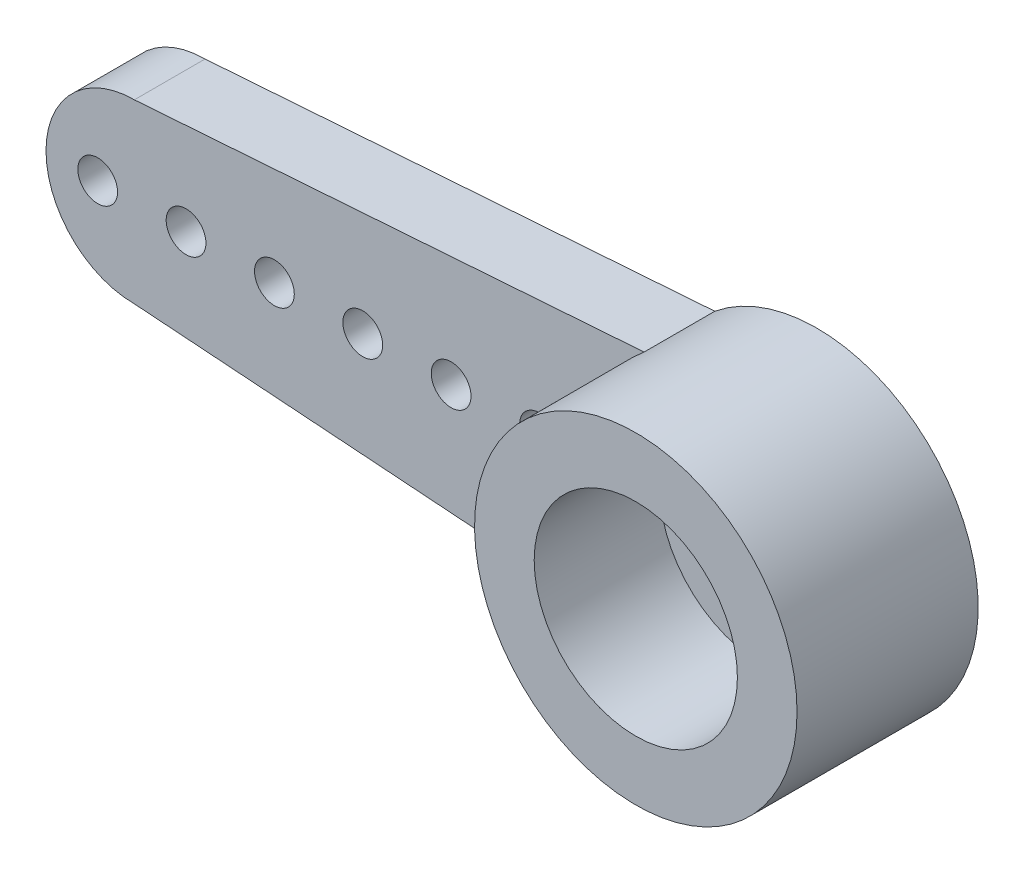
ISO-10303-21;
HEADER;
FILE_DESCRIPTION(('STEP AP214'),'2;1');
FILE_NAME('part.step','',(''),(''),'','','');
FILE_SCHEMA(('AUTOMOTIVE_DESIGN { 1 0 10303 214 1 1 1 1 }'));
ENDSEC;
DATA;
#1=APPLICATION_CONTEXT('core data for automotive mechanical design processes');
#2=APPLICATION_PROTOCOL_DEFINITION('international standard','automotive_design',2000,#1);
#3=PRODUCT_CONTEXT('',#1,'mechanical');
#4=PRODUCT('Part','Part','',(#3));
#5=PRODUCT_RELATED_PRODUCT_CATEGORY('part','',(#4));
#6=PRODUCT_DEFINITION_FORMATION('','',#4);
#7=PRODUCT_DEFINITION_CONTEXT('part definition',#1,'design');
#8=PRODUCT_DEFINITION('design','',#6,#7);
#9=PRODUCT_DEFINITION_SHAPE('','',#8);
#10=(LENGTH_UNIT() NAMED_UNIT(*) SI_UNIT(.MILLI.,.METRE.));
#11=(NAMED_UNIT(*) PLANE_ANGLE_UNIT() SI_UNIT($,.RADIAN.));
#12=(NAMED_UNIT(*) SI_UNIT($,.STERADIAN.) SOLID_ANGLE_UNIT());
#13=UNCERTAINTY_MEASURE_WITH_UNIT(LENGTH_MEASURE(1.E-05),#10,'distance_accuracy_value','');
#14=(GEOMETRIC_REPRESENTATION_CONTEXT(3) GLOBAL_UNCERTAINTY_ASSIGNED_CONTEXT((#13)) GLOBAL_UNIT_ASSIGNED_CONTEXT((#10,
#11,#12)) REPRESENTATION_CONTEXT('',''));
#15=CARTESIAN_POINT('',(0.,0.,0.));
#16=DIRECTION('',(0.,0.,1.));
#17=DIRECTION('',(1.,0.,0.));
#18=AXIS2_PLACEMENT_3D('',#15,#16,#17);
#19=CARTESIAN_POINT('',(0.,0.,2.84));
#20=DIRECTION('',(0.,0.,-1.));
#21=DIRECTION('',(-1.,0.,0.));
#22=AXIS2_PLACEMENT_3D('',#19,#20,#21);
#23=CYLINDRICAL_SURFACE('',#22,1.3);
#24=CARTESIAN_POINT('',(0.,0.,1.26));
#25=DIRECTION('',(0.,0.,1.));
#26=DIRECTION('',(1.,0.,0.));
#27=AXIS2_PLACEMENT_3D('',#24,#25,#26);
#28=CIRCLE('',#27,1.3);
#29=CARTESIAN_POINT('',(-1.3,0.,1.26));
#30=VERTEX_POINT('',#29);
#31=EDGE_CURVE('E117',#30,#30,#28,.T.);
#32=CARTESIAN_POINT('',(0.,0.,0.78));
#33=DIRECTION('',(0.,0.,-1.));
#34=DIRECTION('',(-1.,0.,0.));
#35=AXIS2_PLACEMENT_3D('',#32,#33,#34);
#36=CIRCLE('',#35,1.3);
#37=CARTESIAN_POINT('',(-1.3,0.,0.78));
#38=VERTEX_POINT('',#37);
#39=EDGE_CURVE('E34',#38,#38,#36,.F.);
#40=CARTESIAN_POINT('',(-1.3,0.,1.26));
#41=CARTESIAN_POINT('',(-1.3,0.,1.255));
#42=CARTESIAN_POINT('',(-1.3,0.,1.25));
#43=CARTESIAN_POINT('',(-1.3,0.,1.24));
#44=CARTESIAN_POINT('',(-1.3,0.,1.235));
#45=CARTESIAN_POINT('',(-1.3,0.,1.225));
#46=CARTESIAN_POINT('',(-1.3,0.,1.22));
#47=CARTESIAN_POINT('',(-1.3,0.,1.21));
#48=CARTESIAN_POINT('',(-1.3,0.,1.205));
#49=CARTESIAN_POINT('',(-1.3,0.,1.195));
#50=CARTESIAN_POINT('',(-1.3,0.,1.19));
#51=CARTESIAN_POINT('',(-1.3,0.,1.18));
#52=CARTESIAN_POINT('',(-1.3,0.,1.175));
#53=CARTESIAN_POINT('',(-1.3,0.,1.165));
#54=CARTESIAN_POINT('',(-1.3,0.,1.16));
#55=CARTESIAN_POINT('',(-1.3,0.,1.15));
#56=CARTESIAN_POINT('',(-1.3,0.,1.145));
#57=CARTESIAN_POINT('',(-1.3,0.,1.135));
#58=CARTESIAN_POINT('',(-1.3,0.,1.13));
#59=CARTESIAN_POINT('',(-1.3,0.,1.12));
#60=CARTESIAN_POINT('',(-1.3,0.,1.115));
#61=CARTESIAN_POINT('',(-1.3,0.,1.105));
#62=CARTESIAN_POINT('',(-1.3,0.,1.1));
#63=CARTESIAN_POINT('',(-1.3,0.,1.09));
#64=CARTESIAN_POINT('',(-1.3,0.,1.085));
#65=CARTESIAN_POINT('',(-1.3,0.,1.075));
#66=CARTESIAN_POINT('',(-1.3,0.,1.07));
#67=CARTESIAN_POINT('',(-1.3,0.,1.06));
#68=CARTESIAN_POINT('',(-1.3,0.,1.055));
#69=CARTESIAN_POINT('',(-1.3,0.,1.045));
#70=CARTESIAN_POINT('',(-1.3,0.,1.04));
#71=CARTESIAN_POINT('',(-1.3,0.,1.03));
#72=CARTESIAN_POINT('',(-1.3,0.,1.025));
#73=CARTESIAN_POINT('',(-1.3,0.,1.015));
#74=CARTESIAN_POINT('',(-1.3,0.,1.01));
#75=CARTESIAN_POINT('',(-1.3,0.,1.));
#76=CARTESIAN_POINT('',(-1.3,0.,0.995));
#77=CARTESIAN_POINT('',(-1.3,0.,0.985));
#78=CARTESIAN_POINT('',(-1.3,0.,0.98));
#79=CARTESIAN_POINT('',(-1.3,0.,0.97));
#80=CARTESIAN_POINT('',(-1.3,0.,0.965));
#81=CARTESIAN_POINT('',(-1.3,0.,0.955));
#82=CARTESIAN_POINT('',(-1.3,0.,0.95));
#83=CARTESIAN_POINT('',(-1.3,0.,0.94));
#84=CARTESIAN_POINT('',(-1.3,0.,0.935));
#85=CARTESIAN_POINT('',(-1.3,0.,0.925));
#86=CARTESIAN_POINT('',(-1.3,0.,0.92));
#87=CARTESIAN_POINT('',(-1.3,0.,0.91));
#88=CARTESIAN_POINT('',(-1.3,0.,0.905));
#89=CARTESIAN_POINT('',(-1.3,0.,0.895));
#90=CARTESIAN_POINT('',(-1.3,0.,0.89));
#91=CARTESIAN_POINT('',(-1.3,0.,0.88));
#92=CARTESIAN_POINT('',(-1.3,0.,0.875));
#93=CARTESIAN_POINT('',(-1.3,0.,0.865));
#94=CARTESIAN_POINT('',(-1.3,0.,0.86));
#95=CARTESIAN_POINT('',(-1.3,0.,0.85));
#96=CARTESIAN_POINT('',(-1.3,0.,0.845));
#97=CARTESIAN_POINT('',(-1.3,0.,0.835));
#98=CARTESIAN_POINT('',(-1.3,0.,0.83));
#99=CARTESIAN_POINT('',(-1.3,0.,0.82));
#100=CARTESIAN_POINT('',(-1.3,0.,0.815));
#101=CARTESIAN_POINT('',(-1.3,0.,0.805));
#102=CARTESIAN_POINT('',(-1.3,0.,0.8));
#103=CARTESIAN_POINT('',(-1.3,0.,0.79));
#104=CARTESIAN_POINT('',(-1.3,0.,0.785));
#105=CARTESIAN_POINT('',(-1.3,0.,0.78));
#106=B_SPLINE_CURVE_WITH_KNOTS('',3,(#40,#41,#42,#43,#44,#45,#46,#47,#48,#49,#50,#51,#52,#53,
#54,#55,#56,#57,#58,#59,#60,#61,#62,#63,#64,#65,#66,#67,#68,#69,#70,#71,#72,#73,#74,#75,#76,#77,
#78,#79,#80,#81,#82,#83,#84,#85,#86,#87,#88,#89,#90,#91,#92,#93,#94,#95,#96,#97,#98,#99,#100,
#101,#102,#103,#104,#105),.UNSPECIFIED.,.F.,.F.,(4,2,2,2,2,2,2,2,2,2,2,2,2,2,2,2,2,2,2,2,2,2,2,
2,2,2,2,2,2,2,2,2,4),(0.,0.015,0.0300000000000001,0.0450000000000001,0.0600000000000002,
0.0750000000000002,0.0900000000000002,0.105,0.12,0.135,0.15,0.165,0.18,0.195,0.21,0.225,0.24,
0.255,0.270000000000001,0.285000000000001,0.300000000000001,0.315000000000001,0.33,
0.345000000000001,0.36,0.375000000000001,0.39,0.405000000000001,0.42,0.435000000000001,
0.450000000000001,0.465,0.480000000000001),.UNSPECIFIED.);
#107=EDGE_CURVE('BSEAM30',#30,#38,#106,.T.);
#108=ORIENTED_EDGE('',*,*,#31,.T.);
#109=ORIENTED_EDGE('',*,*,#39,.F.);
#110=ORIENTED_EDGE('',*,*,#107,.T.);
#111=ORIENTED_EDGE('',*,*,#107,.F.);
#112=EDGE_LOOP('',(#108,#110,#109,#111));
#113=FACE_BOUND('',#112,.T.);
#114=ADVANCED_FACE('F30',(#113),#23,.F.);
#115=CARTESIAN_POINT('',(-13.85,0.,1.6));
#116=DIRECTION('',(0.,0.,-1.));
#117=DIRECTION('',(-1.,0.,0.));
#118=AXIS2_PLACEMENT_3D('',#115,#116,#117);
#119=CYLINDRICAL_SURFACE('',#118,2.);
#120=CARTESIAN_POINT('',(-13.85,0.,0.));
#121=DIRECTION('',(0.,0.,1.));
#122=DIRECTION('',(1.,0.,0.));
#123=AXIS2_PLACEMENT_3D('',#120,#121,#122);
#124=CIRCLE('',#123,2.);
#125=CARTESIAN_POINT('',(-13.85,2.,0.));
#126=VERTEX_POINT('',#125);
#127=CARTESIAN_POINT('',(-13.85,-2.,0.));
#128=VERTEX_POINT('',#127);
#129=EDGE_CURVE('E95',#126,#128,#124,.T.);
#130=ORIENTED_EDGE('',*,*,#129,.T.);
#131=DIRECTION('',(0.,0.,-1.));
#132=VECTOR('',#131,1.);
#133=CARTESIAN_POINT('',(-13.85,-2.,1.6));
#134=LINE('',#133,#132);
#135=CARTESIAN_POINT('',(-13.85,-2.,1.6));
#136=VERTEX_POINT('',#135);
#137=EDGE_CURVE('E11',#136,#128,#134,.T.);
#138=ORIENTED_EDGE('',*,*,#137,.F.);
#139=CARTESIAN_POINT('',(-13.85,0.,1.6));
#140=DIRECTION('',(0.,0.,1.));
#141=DIRECTION('',(1.,0.,0.));
#142=AXIS2_PLACEMENT_3D('',#139,#140,#141);
#143=CIRCLE('',#142,2.);
#144=CARTESIAN_POINT('',(-13.85,2.,1.6));
#145=VERTEX_POINT('',#144);
#146=EDGE_CURVE('E103',#145,#136,#143,.T.);
#147=ORIENTED_EDGE('',*,*,#146,.F.);
#148=DIRECTION('',(0.,0.,-1.));
#149=VECTOR('',#148,1.);
#150=CARTESIAN_POINT('',(-13.85,2.,1.6));
#151=LINE('',#150,#149);
#152=EDGE_CURVE('E82',#145,#126,#151,.T.);
#153=ORIENTED_EDGE('',*,*,#152,.T.);
#154=EDGE_LOOP('',(#130,#138,#147,#153));
#155=FACE_BOUND('',#154,.T.);
#156=ADVANCED_FACE('F32',(#155),#119,.T.);
#157=CARTESIAN_POINT('',(-13.85,-2.,1.6));
#158=DIRECTION('',(0.0713161589234498,0.997453761071863,0.));
#159=DIRECTION('',(-0.997453761071863,0.0713161589234498,0.));
#160=AXIS2_PLACEMENT_3D('',#157,#158,#159);
#161=PLANE('',#160);
#162=DIRECTION('',(0.997453761071863,-0.0713161589234498,0.));
#163=VECTOR('',#162,1.);
#164=CARTESIAN_POINT('',(-13.85,-2.,0.));
#165=LINE('',#164,#163);
#166=CARTESIAN_POINT('',(-2.31124966197943,-2.825,0.));
#167=VERTEX_POINT('',#166);
#168=EDGE_CURVE('E253',#128,#167,#165,.T.);
#169=ORIENTED_EDGE('',*,*,#168,.T.);
#170=DIRECTION('',(0.,0.,-1.));
#171=VECTOR('',#170,1.);
#172=CARTESIAN_POINT('',(-2.31124966197943,-2.825,1.6));
#173=LINE('',#172,#171);
#174=CARTESIAN_POINT('',(-2.31124966197943,-2.825,1.6));
#175=VERTEX_POINT('',#174);
#176=EDGE_CURVE('E40',#175,#167,#173,.T.);
#177=ORIENTED_EDGE('',*,*,#176,.F.);
#178=DIRECTION('',(0.997453761071863,-0.0713161589234498,0.));
#179=VECTOR('',#178,1.);
#180=CARTESIAN_POINT('',(-13.85,-2.,1.6));
#181=LINE('',#180,#179);
#182=EDGE_CURVE('E78',#136,#175,#181,.T.);
#183=ORIENTED_EDGE('',*,*,#182,.F.);
#184=ORIENTED_EDGE('',*,*,#137,.T.);
#185=EDGE_LOOP('',(#169,#177,#183,#184));
#186=FACE_BOUND('',#185,.T.);
#187=ADVANCED_FACE('F180',(#186),#161,.F.);
#188=CARTESIAN_POINT('',(0.,0.,1.6));
#189=DIRECTION('',(0.,0.,-1.));
#190=DIRECTION('',(-1.,0.,0.));
#191=AXIS2_PLACEMENT_3D('',#188,#189,#190);
#192=CYLINDRICAL_SURFACE('',#191,3.65);
#193=CARTESIAN_POINT('',(0.,0.,0.));
#194=DIRECTION('',(0.,0.,1.));
#195=DIRECTION('',(1.,0.,0.));
#196=AXIS2_PLACEMENT_3D('',#193,#194,#195);
#197=CIRCLE('',#196,3.65);
#198=CARTESIAN_POINT('',(-2.31124966197942,2.825,0.));
#199=VERTEX_POINT('',#198);
#200=EDGE_CURVE('E68',#167,#199,#197,.T.);
#201=ORIENTED_EDGE('',*,*,#200,.T.);
#202=DIRECTION('',(0.,0.,-1.));
#203=VECTOR('',#202,1.);
#204=CARTESIAN_POINT('',(-2.31124966197942,2.825,1.6));
#205=LINE('',#204,#203);
#206=CARTESIAN_POINT('',(-2.31124966197942,2.825,1.6));
#207=VERTEX_POINT('',#206);
#208=EDGE_CURVE('E81',#207,#199,#205,.T.);
#209=ORIENTED_EDGE('',*,*,#208,.F.);
#210=CARTESIAN_POINT('',(0.,0.,1.6));
#211=DIRECTION('',(0.,0.,1.));
#212=DIRECTION('',(1.,0.,0.));
#213=AXIS2_PLACEMENT_3D('',#210,#211,#212);
#214=CIRCLE('',#213,3.65);
#215=EDGE_CURVE('E88',#207,#175,#214,.T.);
#216=ORIENTED_EDGE('',*,*,#215,.T.);
#217=ORIENTED_EDGE('',*,*,#176,.T.);
#218=EDGE_LOOP('',(#201,#209,#216,#217));
#219=FACE_BOUND('',#218,.T.);
#220=CARTESIAN_POINT('',(0.,0.,4.1));
#221=DIRECTION('',(0.,0.,1.));
#222=DIRECTION('',(1.,0.,0.));
#223=AXIS2_PLACEMENT_3D('',#220,#221,#222);
#224=CIRCLE('',#223,3.65);
#225=CARTESIAN_POINT('',(3.65,0.,4.1));
#226=VERTEX_POINT('',#225);
#227=EDGE_CURVE('E91',#226,#226,#224,.T.);
#228=ORIENTED_EDGE('',*,*,#227,.F.);
#229=EDGE_LOOP('',(#228));
#230=FACE_BOUND('',#229,.T.);
#231=ADVANCED_FACE('F86',(#219,#230),#192,.T.);
#232=CARTESIAN_POINT('',(-13.85,2.,1.6));
#233=DIRECTION('',(0.0713161589234501,-0.997453761071863,0.));
#234=DIRECTION('',(0.997453761071863,0.0713161589234501,0.));
#235=AXIS2_PLACEMENT_3D('',#232,#233,#234);
#236=PLANE('',#235);
#237=DIRECTION('',(-0.997453761071863,-0.0713161589234501,0.));
#238=VECTOR('',#237,1.);
#239=CARTESIAN_POINT('',(-13.85,2.,0.));
#240=LINE('',#239,#238);
#241=EDGE_CURVE('E73',#199,#126,#240,.T.);
#242=ORIENTED_EDGE('',*,*,#241,.T.);
#243=ORIENTED_EDGE('',*,*,#152,.F.);
#244=DIRECTION('',(-0.997453761071863,-0.0713161589234501,0.));
#245=VECTOR('',#244,1.);
#246=CARTESIAN_POINT('',(-13.85,2.,1.6));
#247=LINE('',#246,#245);
#248=EDGE_CURVE('E49',#207,#145,#247,.T.);
#249=ORIENTED_EDGE('',*,*,#248,.F.);
#250=ORIENTED_EDGE('',*,*,#208,.T.);
#251=EDGE_LOOP('',(#242,#243,#249,#250));
#252=FACE_BOUND('',#251,.T.);
#253=ADVANCED_FACE('F80',(#252),#236,.F.);
#254=CARTESIAN_POINT('',(-13.85,0.,1.6));
#255=DIRECTION('',(0.,0.,1.));
#256=DIRECTION('',(1.,0.,0.));
#257=AXIS2_PLACEMENT_3D('',#254,#255,#256);
#258=PLANE('',#257);
#259=CARTESIAN_POINT('',(-14.68,0.,1.6));
#260=DIRECTION('',(0.,0.,1.));
#261=DIRECTION('',(1.,0.,0.));
#262=AXIS2_PLACEMENT_3D('',#259,#260,#261);
#263=CIRCLE('',#262,0.45);
#264=CARTESIAN_POINT('',(-14.23,0.,1.6));
#265=VERTEX_POINT('',#264);
#266=EDGE_CURVE('E119',#265,#265,#263,.T.);
#267=ORIENTED_EDGE('',*,*,#266,.F.);
#268=EDGE_LOOP('',(#267));
#269=FACE_BOUND('',#268,.T.);
#270=CARTESIAN_POINT('',(-12.68,0.,1.6));
#271=DIRECTION('',(0.,0.,1.));
#272=DIRECTION('',(1.,0.,0.));
#273=AXIS2_PLACEMENT_3D('',#270,#271,#272);
#274=CIRCLE('',#273,0.45);
#275=CARTESIAN_POINT('',(-12.23,0.,1.6));
#276=VERTEX_POINT('',#275);
#277=EDGE_CURVE('E139',#276,#276,#274,.T.);
#278=ORIENTED_EDGE('',*,*,#277,.F.);
#279=EDGE_LOOP('',(#278));
#280=FACE_BOUND('',#279,.T.);
#281=CARTESIAN_POINT('',(-10.68,0.,1.6));
#282=DIRECTION('',(0.,0.,1.));
#283=DIRECTION('',(1.,0.,0.));
#284=AXIS2_PLACEMENT_3D('',#281,#282,#283);
#285=CIRCLE('',#284,0.45);
#286=CARTESIAN_POINT('',(-10.23,0.,1.6));
#287=VERTEX_POINT('',#286);
#288=EDGE_CURVE('E145',#287,#287,#285,.T.);
#289=ORIENTED_EDGE('',*,*,#288,.F.);
#290=EDGE_LOOP('',(#289));
#291=FACE_BOUND('',#290,.T.);
#292=CARTESIAN_POINT('',(-8.68,0.,1.6));
#293=DIRECTION('',(0.,0.,1.));
#294=DIRECTION('',(1.,0.,0.));
#295=AXIS2_PLACEMENT_3D('',#292,#293,#294);
#296=CIRCLE('',#295,0.45);
#297=CARTESIAN_POINT('',(-8.23,0.,1.6));
#298=VERTEX_POINT('',#297);
#299=EDGE_CURVE('E151',#298,#298,#296,.T.);
#300=ORIENTED_EDGE('',*,*,#299,.F.);
#301=EDGE_LOOP('',(#300));
#302=FACE_BOUND('',#301,.T.);
#303=CARTESIAN_POINT('',(-6.68,0.,1.6));
#304=DIRECTION('',(0.,0.,1.));
#305=DIRECTION('',(1.,0.,0.));
#306=AXIS2_PLACEMENT_3D('',#303,#304,#305);
#307=CIRCLE('',#306,0.45);
#308=CARTESIAN_POINT('',(-6.23,0.,1.6));
#309=VERTEX_POINT('',#308);
#310=EDGE_CURVE('E157',#309,#309,#307,.T.);
#311=ORIENTED_EDGE('',*,*,#310,.F.);
#312=EDGE_LOOP('',(#311));
#313=FACE_BOUND('',#312,.T.);
#314=CARTESIAN_POINT('',(-4.68,0.,1.6));
#315=DIRECTION('',(0.,0.,1.));
#316=DIRECTION('',(1.,0.,0.));
#317=AXIS2_PLACEMENT_3D('',#314,#315,#316);
#318=CIRCLE('',#317,0.45);
#319=CARTESIAN_POINT('',(-4.23,0.,1.6));
#320=VERTEX_POINT('',#319);
#321=EDGE_CURVE('E163',#320,#320,#318,.T.);
#322=ORIENTED_EDGE('',*,*,#321,.F.);
#323=EDGE_LOOP('',(#322));
#324=FACE_BOUND('',#323,.T.);
#325=ORIENTED_EDGE('',*,*,#215,.F.);
#326=ORIENTED_EDGE('',*,*,#248,.T.);
#327=ORIENTED_EDGE('',*,*,#146,.T.);
#328=ORIENTED_EDGE('',*,*,#182,.T.);
#329=EDGE_LOOP('',(#325,#326,#327,#328));
#330=FACE_BOUND('',#329,.T.);
#331=ADVANCED_FACE('F90',(#269,#280,#291,#302,#313,#324,#330),#258,.T.);
#332=CARTESIAN_POINT('',(-13.85,0.,0.));
#333=DIRECTION('',(0.,0.,1.));
#334=DIRECTION('',(1.,0.,0.));
#335=AXIS2_PLACEMENT_3D('',#332,#333,#334);
#336=PLANE('',#335);
#337=CARTESIAN_POINT('',(0.,0.,0.));
#338=DIRECTION('',(0.,0.,-1.));
#339=DIRECTION('',(-1.,0.,0.));
#340=AXIS2_PLACEMENT_3D('',#337,#338,#339);
#341=CIRCLE('',#340,2.45);
#342=CARTESIAN_POINT('',(-2.45,0.,0.));
#343=VERTEX_POINT('',#342);
#344=EDGE_CURVE('E130',#343,#343,#341,.T.);
#345=ORIENTED_EDGE('',*,*,#344,.F.);
#346=EDGE_LOOP('',(#345));
#347=FACE_BOUND('',#346,.T.);
#348=CARTESIAN_POINT('',(-14.68,0.,0.));
#349=DIRECTION('',(0.,0.,1.));
#350=DIRECTION('',(1.,0.,0.));
#351=AXIS2_PLACEMENT_3D('',#348,#349,#350);
#352=CIRCLE('',#351,0.45);
#353=CARTESIAN_POINT('',(-14.23,0.,0.));
#354=VERTEX_POINT('',#353);
#355=EDGE_CURVE('E123',#354,#354,#352,.F.);
#356=ORIENTED_EDGE('',*,*,#355,.F.);
#357=EDGE_LOOP('',(#356));
#358=FACE_BOUND('',#357,.T.);
#359=CARTESIAN_POINT('',(-12.68,0.,0.));
#360=DIRECTION('',(0.,0.,1.));
#361=DIRECTION('',(1.,0.,0.));
#362=AXIS2_PLACEMENT_3D('',#359,#360,#361);
#363=CIRCLE('',#362,0.45);
#364=CARTESIAN_POINT('',(-12.23,0.,0.));
#365=VERTEX_POINT('',#364);
#366=EDGE_CURVE('E142',#365,#365,#363,.F.);
#367=ORIENTED_EDGE('',*,*,#366,.F.);
#368=EDGE_LOOP('',(#367));
#369=FACE_BOUND('',#368,.T.);
#370=CARTESIAN_POINT('',(-10.68,0.,0.));
#371=DIRECTION('',(0.,0.,1.));
#372=DIRECTION('',(1.,0.,0.));
#373=AXIS2_PLACEMENT_3D('',#370,#371,#372);
#374=CIRCLE('',#373,0.45);
#375=CARTESIAN_POINT('',(-10.23,0.,0.));
#376=VERTEX_POINT('',#375);
#377=EDGE_CURVE('E148',#376,#376,#374,.F.);
#378=ORIENTED_EDGE('',*,*,#377,.F.);
#379=EDGE_LOOP('',(#378));
#380=FACE_BOUND('',#379,.T.);
#381=CARTESIAN_POINT('',(-8.68,0.,0.));
#382=DIRECTION('',(0.,0.,1.));
#383=DIRECTION('',(1.,0.,0.));
#384=AXIS2_PLACEMENT_3D('',#381,#382,#383);
#385=CIRCLE('',#384,0.45);
#386=CARTESIAN_POINT('',(-8.23,0.,0.));
#387=VERTEX_POINT('',#386);
#388=EDGE_CURVE('E154',#387,#387,#385,.F.);
#389=ORIENTED_EDGE('',*,*,#388,.F.);
#390=EDGE_LOOP('',(#389));
#391=FACE_BOUND('',#390,.T.);
#392=CARTESIAN_POINT('',(-6.68,0.,0.));
#393=DIRECTION('',(0.,0.,1.));
#394=DIRECTION('',(1.,0.,0.));
#395=AXIS2_PLACEMENT_3D('',#392,#393,#394);
#396=CIRCLE('',#395,0.45);
#397=CARTESIAN_POINT('',(-6.23,0.,0.));
#398=VERTEX_POINT('',#397);
#399=EDGE_CURVE('E160',#398,#398,#396,.F.);
#400=ORIENTED_EDGE('',*,*,#399,.F.);
#401=EDGE_LOOP('',(#400));
#402=FACE_BOUND('',#401,.T.);
#403=CARTESIAN_POINT('',(-4.68,0.,0.));
#404=DIRECTION('',(0.,0.,1.));
#405=DIRECTION('',(1.,0.,0.));
#406=AXIS2_PLACEMENT_3D('',#403,#404,#405);
#407=CIRCLE('',#406,0.45);
#408=CARTESIAN_POINT('',(-4.23,0.,0.));
#409=VERTEX_POINT('',#408);
#410=EDGE_CURVE('E166',#409,#409,#407,.F.);
#411=ORIENTED_EDGE('',*,*,#410,.F.);
#412=EDGE_LOOP('',(#411));
#413=FACE_BOUND('',#412,.T.);
#414=ORIENTED_EDGE('',*,*,#129,.F.);
#415=ORIENTED_EDGE('',*,*,#241,.F.);
#416=ORIENTED_EDGE('',*,*,#200,.F.);
#417=ORIENTED_EDGE('',*,*,#168,.F.);
#418=EDGE_LOOP('',(#414,#415,#416,#417));
#419=FACE_BOUND('',#418,.T.);
#420=ADVANCED_FACE('F176',(#347,#358,#369,#380,#391,#402,#413,#419),#336,.F.);
#421=CARTESIAN_POINT('',(0.,0.,4.1));
#422=DIRECTION('',(0.,0.,1.));
#423=DIRECTION('',(1.,0.,0.));
#424=AXIS2_PLACEMENT_3D('',#421,#422,#423);
#425=PLANE('',#424);
#426=CARTESIAN_POINT('',(0.,0.,4.1));
#427=DIRECTION('',(0.,0.,1.));
#428=DIRECTION('',(1.,0.,0.));
#429=AXIS2_PLACEMENT_3D('',#426,#427,#428);
#430=CIRCLE('',#429,2.3);
#431=CARTESIAN_POINT('',(2.3,0.,4.1));
#432=VERTEX_POINT('',#431);
#433=EDGE_CURVE('E98',#432,#432,#430,.T.);
#434=ORIENTED_EDGE('',*,*,#433,.F.);
#435=EDGE_LOOP('',(#434));
#436=FACE_BOUND('',#435,.T.);
#437=ORIENTED_EDGE('',*,*,#227,.T.);
#438=EDGE_LOOP('',(#437));
#439=FACE_BOUND('',#438,.T.);
#440=ADVANCED_FACE('F173',(#436,#439),#425,.T.);
#441=CARTESIAN_POINT('',(0.,0.,1.26));
#442=DIRECTION('',(0.,0.,1.));
#443=DIRECTION('',(1.,0.,0.));
#444=AXIS2_PLACEMENT_3D('',#441,#442,#443);
#445=CYLINDRICAL_SURFACE('',#444,2.3);
#446=CARTESIAN_POINT('',(0.,0.,1.26));
#447=DIRECTION('',(0.,0.,1.));
#448=DIRECTION('',(1.,0.,0.));
#449=AXIS2_PLACEMENT_3D('',#446,#447,#448);
#450=CIRCLE('',#449,2.3);
#451=CARTESIAN_POINT('',(2.3,0.,1.26));
#452=VERTEX_POINT('',#451);
#453=EDGE_CURVE('E92',#452,#452,#450,.T.);
#454=CARTESIAN_POINT('',(2.3,0.,1.26));
#455=CARTESIAN_POINT('',(2.3,0.,1.28958333333333));
#456=CARTESIAN_POINT('',(2.3,0.,1.31916666666667));
#457=CARTESIAN_POINT('',(2.3,0.,1.37833333333333));
#458=CARTESIAN_POINT('',(2.3,0.,1.40791666666667));
#459=CARTESIAN_POINT('',(2.3,0.,1.46708333333333));
#460=CARTESIAN_POINT('',(2.3,0.,1.49666666666667));
#461=CARTESIAN_POINT('',(2.3,0.,1.55583333333333));
#462=CARTESIAN_POINT('',(2.3,0.,1.58541666666667));
#463=CARTESIAN_POINT('',(2.3,0.,1.64458333333333));
#464=CARTESIAN_POINT('',(2.3,0.,1.67416666666667));
#465=CARTESIAN_POINT('',(2.3,0.,1.73333333333333));
#466=CARTESIAN_POINT('',(2.3,0.,1.76291666666667));
#467=CARTESIAN_POINT('',(2.3,0.,1.82208333333333));
#468=CARTESIAN_POINT('',(2.3,0.,1.85166666666667));
#469=CARTESIAN_POINT('',(2.3,0.,1.91083333333333));
#470=CARTESIAN_POINT('',(2.3,0.,1.94041666666667));
#471=CARTESIAN_POINT('',(2.3,0.,1.99958333333333));
#472=CARTESIAN_POINT('',(2.3,0.,2.02916666666667));
#473=CARTESIAN_POINT('',(2.3,0.,2.08833333333333));
#474=CARTESIAN_POINT('',(2.3,0.,2.11791666666667));
#475=CARTESIAN_POINT('',(2.3,0.,2.17708333333333));
#476=CARTESIAN_POINT('',(2.3,0.,2.20666666666667));
#477=CARTESIAN_POINT('',(2.3,0.,2.26583333333333));
#478=CARTESIAN_POINT('',(2.3,0.,2.29541666666667));
#479=CARTESIAN_POINT('',(2.3,0.,2.35458333333333));
#480=CARTESIAN_POINT('',(2.3,0.,2.38416666666667));
#481=CARTESIAN_POINT('',(2.3,0.,2.44333333333333));
#482=CARTESIAN_POINT('',(2.3,0.,2.47291666666667));
#483=CARTESIAN_POINT('',(2.3,0.,2.53208333333333));
#484=CARTESIAN_POINT('',(2.3,0.,2.56166666666667));
#485=CARTESIAN_POINT('',(2.3,0.,2.62083333333333));
#486=CARTESIAN_POINT('',(2.3,0.,2.65041666666667));
#487=CARTESIAN_POINT('',(2.3,0.,2.70958333333333));
#488=CARTESIAN_POINT('',(2.3,0.,2.73916666666667));
#489=CARTESIAN_POINT('',(2.3,0.,2.79833333333333));
#490=CARTESIAN_POINT('',(2.3,0.,2.82791666666667));
#491=CARTESIAN_POINT('',(2.3,0.,2.88708333333333));
#492=CARTESIAN_POINT('',(2.3,0.,2.91666666666667));
#493=CARTESIAN_POINT('',(2.3,0.,2.97583333333333));
#494=CARTESIAN_POINT('',(2.3,0.,3.00541666666667));
#495=CARTESIAN_POINT('',(2.3,0.,3.06458333333333));
#496=CARTESIAN_POINT('',(2.3,0.,3.09416666666667));
#497=CARTESIAN_POINT('',(2.3,0.,3.15333333333333));
#498=CARTESIAN_POINT('',(2.3,0.,3.18291666666667));
#499=CARTESIAN_POINT('',(2.3,0.,3.24208333333333));
#500=CARTESIAN_POINT('',(2.3,0.,3.27166666666667));
#501=CARTESIAN_POINT('',(2.3,0.,3.33083333333333));
#502=CARTESIAN_POINT('',(2.3,0.,3.36041666666667));
#503=CARTESIAN_POINT('',(2.3,0.,3.41958333333333));
#504=CARTESIAN_POINT('',(2.3,0.,3.44916666666667));
#505=CARTESIAN_POINT('',(2.3,0.,3.50833333333333));
#506=CARTESIAN_POINT('',(2.3,0.,3.53791666666667));
#507=CARTESIAN_POINT('',(2.3,0.,3.59708333333333));
#508=CARTESIAN_POINT('',(2.3,0.,3.62666666666667));
#509=CARTESIAN_POINT('',(2.3,0.,3.68583333333333));
#510=CARTESIAN_POINT('',(2.3,0.,3.71541666666667));
#511=CARTESIAN_POINT('',(2.3,0.,3.77458333333333));
#512=CARTESIAN_POINT('',(2.3,0.,3.80416666666667));
#513=CARTESIAN_POINT('',(2.3,0.,3.86333333333333));
#514=CARTESIAN_POINT('',(2.3,0.,3.89291666666667));
#515=CARTESIAN_POINT('',(2.3,0.,3.95208333333333));
#516=CARTESIAN_POINT('',(2.3,0.,3.98166666666667));
#517=CARTESIAN_POINT('',(2.3,0.,4.04083333333333));
#518=CARTESIAN_POINT('',(2.3,0.,4.07041666666667));
#519=CARTESIAN_POINT('',(2.3,0.,4.1));
#520=B_SPLINE_CURVE_WITH_KNOTS('',3,(#454,#455,#456,#457,#458,#459,#460,#461,#462,#463,#464,
#465,#466,#467,#468,#469,#470,#471,#472,#473,#474,#475,#476,#477,#478,#479,#480,#481,#482,#483,
#484,#485,#486,#487,#488,#489,#490,#491,#492,#493,#494,#495,#496,#497,#498,#499,#500,#501,#502,
#503,#504,#505,#506,#507,#508,#509,#510,#511,#512,#513,#514,#515,#516,#517,#518,#519),
.UNSPECIFIED.,.F.,.F.,(4,2,2,2,2,2,2,2,2,2,2,2,2,2,2,2,2,2,2,2,2,2,2,2,2,2,2,2,2,2,2,2,4),(0.,
0.0887500000000001,0.1775,0.26625,0.355,0.44375,0.5325,0.62125,0.71,0.79875,0.8875,0.97625,
1.065,1.15375,1.2425,1.33125,1.42,1.50875,1.5975,1.68625,1.775,1.86375,1.9525,2.04125,2.13,
2.21875,2.3075,2.39625,2.485,2.57375,2.6625,2.75125,2.84),.UNSPECIFIED.);
#521=EDGE_CURVE('BSEAM171',#452,#432,#520,.T.);
#522=ORIENTED_EDGE('',*,*,#453,.F.);
#523=ORIENTED_EDGE('',*,*,#433,.T.);
#524=ORIENTED_EDGE('',*,*,#521,.T.);
#525=ORIENTED_EDGE('',*,*,#521,.F.);
#526=EDGE_LOOP('',(#522,#524,#523,#525));
#527=FACE_BOUND('',#526,.T.);
#528=ADVANCED_FACE('F171',(#527),#445,.F.);
#529=CARTESIAN_POINT('',(0.,0.,1.26));
#530=DIRECTION('',(0.,0.,1.));
#531=DIRECTION('',(1.,0.,0.));
#532=AXIS2_PLACEMENT_3D('',#529,#530,#531);
#533=PLANE('',#532);
#534=ORIENTED_EDGE('',*,*,#31,.F.);
#535=EDGE_LOOP('',(#534));
#536=FACE_BOUND('',#535,.T.);
#537=ORIENTED_EDGE('',*,*,#453,.T.);
#538=EDGE_LOOP('',(#537));
#539=FACE_BOUND('',#538,.T.);
#540=ADVANCED_FACE('F222',(#536,#539),#533,.T.);
#541=CARTESIAN_POINT('',(-4.68,0.,-0.00102499999999998));
#542=DIRECTION('',(0.,0.,1.));
#543=DIRECTION('',(1.,0.,0.));
#544=AXIS2_PLACEMENT_3D('',#541,#542,#543);
#545=CYLINDRICAL_SURFACE('',#544,0.45);
#546=ORIENTED_EDGE('',*,*,#321,.T.);
#547=EDGE_LOOP('',(#546));
#548=FACE_BOUND('',#547,.T.);
#549=ORIENTED_EDGE('',*,*,#410,.T.);
#550=EDGE_LOOP('',(#549));
#551=FACE_BOUND('',#550,.T.);
#552=ADVANCED_FACE('F218',(#548,#551),#545,.F.);
#553=CARTESIAN_POINT('',(-6.68,0.,-0.00102499999999998));
#554=DIRECTION('',(0.,0.,1.));
#555=DIRECTION('',(1.,0.,0.));
#556=AXIS2_PLACEMENT_3D('',#553,#554,#555);
#557=CYLINDRICAL_SURFACE('',#556,0.45);
#558=ORIENTED_EDGE('',*,*,#310,.T.);
#559=EDGE_LOOP('',(#558));
#560=FACE_BOUND('',#559,.T.);
#561=ORIENTED_EDGE('',*,*,#399,.T.);
#562=EDGE_LOOP('',(#561));
#563=FACE_BOUND('',#562,.T.);
#564=ADVANCED_FACE('F214',(#560,#563),#557,.F.);
#565=CARTESIAN_POINT('',(-8.68,0.,-0.00102499999999998));
#566=DIRECTION('',(0.,0.,1.));
#567=DIRECTION('',(1.,0.,0.));
#568=AXIS2_PLACEMENT_3D('',#565,#566,#567);
#569=CYLINDRICAL_SURFACE('',#568,0.45);
#570=ORIENTED_EDGE('',*,*,#299,.T.);
#571=EDGE_LOOP('',(#570));
#572=FACE_BOUND('',#571,.T.);
#573=ORIENTED_EDGE('',*,*,#388,.T.);
#574=EDGE_LOOP('',(#573));
#575=FACE_BOUND('',#574,.T.);
#576=ADVANCED_FACE('F210',(#572,#575),#569,.F.);
#577=CARTESIAN_POINT('',(-10.68,0.,-0.00102499999999998));
#578=DIRECTION('',(0.,0.,1.));
#579=DIRECTION('',(1.,0.,0.));
#580=AXIS2_PLACEMENT_3D('',#577,#578,#579);
#581=CYLINDRICAL_SURFACE('',#580,0.45);
#582=ORIENTED_EDGE('',*,*,#288,.T.);
#583=EDGE_LOOP('',(#582));
#584=FACE_BOUND('',#583,.T.);
#585=ORIENTED_EDGE('',*,*,#377,.T.);
#586=EDGE_LOOP('',(#585));
#587=FACE_BOUND('',#586,.T.);
#588=ADVANCED_FACE('F206',(#584,#587),#581,.F.);
#589=CARTESIAN_POINT('',(-12.68,0.,-0.00102499999999998));
#590=DIRECTION('',(0.,0.,1.));
#591=DIRECTION('',(1.,0.,0.));
#592=AXIS2_PLACEMENT_3D('',#589,#590,#591);
#593=CYLINDRICAL_SURFACE('',#592,0.45);
#594=ORIENTED_EDGE('',*,*,#277,.T.);
#595=EDGE_LOOP('',(#594));
#596=FACE_BOUND('',#595,.T.);
#597=ORIENTED_EDGE('',*,*,#366,.T.);
#598=EDGE_LOOP('',(#597));
#599=FACE_BOUND('',#598,.T.);
#600=ADVANCED_FACE('F202',(#596,#599),#593,.F.);
#601=CARTESIAN_POINT('',(-14.68,0.,-0.00102499999999998));
#602=DIRECTION('',(0.,0.,1.));
#603=DIRECTION('',(1.,0.,0.));
#604=AXIS2_PLACEMENT_3D('',#601,#602,#603);
#605=CYLINDRICAL_SURFACE('',#604,0.45);
#606=ORIENTED_EDGE('',*,*,#266,.T.);
#607=EDGE_LOOP('',(#606));
#608=FACE_BOUND('',#607,.T.);
#609=ORIENTED_EDGE('',*,*,#355,.T.);
#610=EDGE_LOOP('',(#609));
#611=FACE_BOUND('',#610,.T.);
#612=ADVANCED_FACE('F198',(#608,#611),#605,.F.);
#613=CARTESIAN_POINT('',(0.,0.,0.78));
#614=DIRECTION('',(0.,0.,-1.));
#615=DIRECTION('',(-1.,0.,0.));
#616=AXIS2_PLACEMENT_3D('',#613,#614,#615);
#617=PLANE('',#616);
#618=CARTESIAN_POINT('',(0.,0.,0.78));
#619=DIRECTION('',(0.,0.,-1.));
#620=DIRECTION('',(-1.,0.,0.));
#621=AXIS2_PLACEMENT_3D('',#618,#619,#620);
#622=CIRCLE('',#621,2.45);
#623=CARTESIAN_POINT('',(-2.45,0.,0.78));
#624=VERTEX_POINT('',#623);
#625=EDGE_CURVE('E126',#624,#624,#622,.T.);
#626=ORIENTED_EDGE('',*,*,#625,.T.);
#627=EDGE_LOOP('',(#626));
#628=FACE_BOUND('',#627,.T.);
#629=ORIENTED_EDGE('',*,*,#39,.T.);
#630=EDGE_LOOP('',(#629));
#631=FACE_BOUND('',#630,.T.);
#632=ADVANCED_FACE('F201',(#628,#631),#617,.T.);
#633=CARTESIAN_POINT('',(0.,0.,0.78));
#634=DIRECTION('',(0.,0.,-1.));
#635=DIRECTION('',(-1.,0.,0.));
#636=AXIS2_PLACEMENT_3D('',#633,#634,#635);
#637=CYLINDRICAL_SURFACE('',#636,2.45);
#638=CARTESIAN_POINT('',(-2.45,0.,0.78));
#639=CARTESIAN_POINT('',(-2.45,0.,0.771875));
#640=CARTESIAN_POINT('',(-2.45,0.,0.76375));
#641=CARTESIAN_POINT('',(-2.45,0.,0.7475));
#642=CARTESIAN_POINT('',(-2.45,0.,0.739375));
#643=CARTESIAN_POINT('',(-2.45,0.,0.723125));
#644=CARTESIAN_POINT('',(-2.45,0.,0.715));
#645=CARTESIAN_POINT('',(-2.45,0.,0.69875));
#646=CARTESIAN_POINT('',(-2.45,0.,0.690625));
#647=CARTESIAN_POINT('',(-2.45,0.,0.674375));
#648=CARTESIAN_POINT('',(-2.45,0.,0.66625));
#649=CARTESIAN_POINT('',(-2.45,0.,0.65));
#650=CARTESIAN_POINT('',(-2.45,0.,0.641875));
#651=CARTESIAN_POINT('',(-2.45,0.,0.625625));
#652=CARTESIAN_POINT('',(-2.45,0.,0.6175));
#653=CARTESIAN_POINT('',(-2.45,0.,0.60125));
#654=CARTESIAN_POINT('',(-2.45,0.,0.593125));
#655=CARTESIAN_POINT('',(-2.45,0.,0.576875));
#656=CARTESIAN_POINT('',(-2.45,0.,0.56875));
#657=CARTESIAN_POINT('',(-2.45,0.,0.5525));
#658=CARTESIAN_POINT('',(-2.45,0.,0.544375));
#659=CARTESIAN_POINT('',(-2.45,0.,0.528125));
#660=CARTESIAN_POINT('',(-2.45,0.,0.52));
#661=CARTESIAN_POINT('',(-2.45,0.,0.50375));
#662=CARTESIAN_POINT('',(-2.45,0.,0.495625));
#663=CARTESIAN_POINT('',(-2.45,0.,0.479375));
#664=CARTESIAN_POINT('',(-2.45,0.,0.47125));
#665=CARTESIAN_POINT('',(-2.45,0.,0.455));
#666=CARTESIAN_POINT('',(-2.45,0.,0.446875));
#667=CARTESIAN_POINT('',(-2.45,0.,0.430625));
#668=CARTESIAN_POINT('',(-2.45,0.,0.4225));
#669=CARTESIAN_POINT('',(-2.45,0.,0.40625));
#670=CARTESIAN_POINT('',(-2.45,0.,0.398125));
#671=CARTESIAN_POINT('',(-2.45,0.,0.381875));
#672=CARTESIAN_POINT('',(-2.45,0.,0.37375));
#673=CARTESIAN_POINT('',(-2.45,0.,0.3575));
#674=CARTESIAN_POINT('',(-2.45,0.,0.349375));
#675=CARTESIAN_POINT('',(-2.45,0.,0.333125));
#676=CARTESIAN_POINT('',(-2.45,0.,0.325));
#677=CARTESIAN_POINT('',(-2.45,0.,0.30875));
#678=CARTESIAN_POINT('',(-2.45,0.,0.300625));
#679=CARTESIAN_POINT('',(-2.45,0.,0.284375));
#680=CARTESIAN_POINT('',(-2.45,0.,0.27625));
#681=CARTESIAN_POINT('',(-2.45,0.,0.26));
#682=CARTESIAN_POINT('',(-2.45,0.,0.251875));
#683=CARTESIAN_POINT('',(-2.45,0.,0.235625));
#684=CARTESIAN_POINT('',(-2.45,0.,0.2275));
#685=CARTESIAN_POINT('',(-2.45,0.,0.21125));
#686=CARTESIAN_POINT('',(-2.45,0.,0.203125));
#687=CARTESIAN_POINT('',(-2.45,0.,0.186875));
#688=CARTESIAN_POINT('',(-2.45,0.,0.17875));
#689=CARTESIAN_POINT('',(-2.45,0.,0.1625));
#690=CARTESIAN_POINT('',(-2.45,0.,0.154375));
#691=CARTESIAN_POINT('',(-2.45,0.,0.138125));
#692=CARTESIAN_POINT('',(-2.45,0.,0.13));
#693=CARTESIAN_POINT('',(-2.45,0.,0.11375));
#694=CARTESIAN_POINT('',(-2.45,0.,0.105625));
#695=CARTESIAN_POINT('',(-2.45,0.,0.089375));
#696=CARTESIAN_POINT('',(-2.45,0.,0.08125));
#697=CARTESIAN_POINT('',(-2.45,0.,0.065));
#698=CARTESIAN_POINT('',(-2.45,0.,0.056875));
#699=CARTESIAN_POINT('',(-2.45,0.,0.040625));
#700=CARTESIAN_POINT('',(-2.45,0.,0.0325));
#701=CARTESIAN_POINT('',(-2.45,0.,0.01625));
#702=CARTESIAN_POINT('',(-2.45,0.,0.00812499999999999));
#703=CARTESIAN_POINT('',(-2.45,0.,0.));
#704=B_SPLINE_CURVE_WITH_KNOTS('',3,(#638,#639,#640,#641,#642,#643,#644,#645,#646,#647,#648,
#649,#650,#651,#652,#653,#654,#655,#656,#657,#658,#659,#660,#661,#662,#663,#664,#665,#666,#667,
#668,#669,#670,#671,#672,#673,#674,#675,#676,#677,#678,#679,#680,#681,#682,#683,#684,#685,#686,
#687,#688,#689,#690,#691,#692,#693,#694,#695,#696,#697,#698,#699,#700,#701,#702,#703),
.UNSPECIFIED.,.F.,.F.,(4,2,2,2,2,2,2,2,2,2,2,2,2,2,2,2,2,2,2,2,2,2,2,2,2,2,2,2,2,2,2,2,4),(0.,
0.0243750000000001,0.0487500000000001,0.0731250000000001,0.0975,0.121875,0.14625,0.170625,0.195,
0.219375,0.24375,0.268125,0.2925,0.316875,0.34125,0.365625,0.39,0.414375,0.43875,0.463125,
0.4875,0.511875,0.53625,0.560625,0.585,0.609375,0.63375,0.658125,0.6825,0.706875,0.73125,
0.755625,0.78),.UNSPECIFIED.);
#705=EDGE_CURVE('BSEAM196',#624,#343,#704,.T.);
#706=ORIENTED_EDGE('',*,*,#625,.F.);
#707=ORIENTED_EDGE('',*,*,#344,.T.);
#708=ORIENTED_EDGE('',*,*,#705,.T.);
#709=ORIENTED_EDGE('',*,*,#705,.F.);
#710=EDGE_LOOP('',(#706,#708,#707,#709));
#711=FACE_BOUND('',#710,.T.);
#712=ADVANCED_FACE('F196',(#711),#637,.F.);
#713=CLOSED_SHELL('',(#114,#156,#187,#231,#253,#331,#420,#440,#528,#540,#552,#564,#576,#588,
#600,#612,#632,#712));
#714=MANIFOLD_SOLID_BREP('B2',#713);
#715=ADVANCED_BREP_SHAPE_REPRESENTATION('',(#18,#714),#14);
#716=SHAPE_DEFINITION_REPRESENTATION(#9,#715);
ENDSEC;
END-ISO-10303-21;
